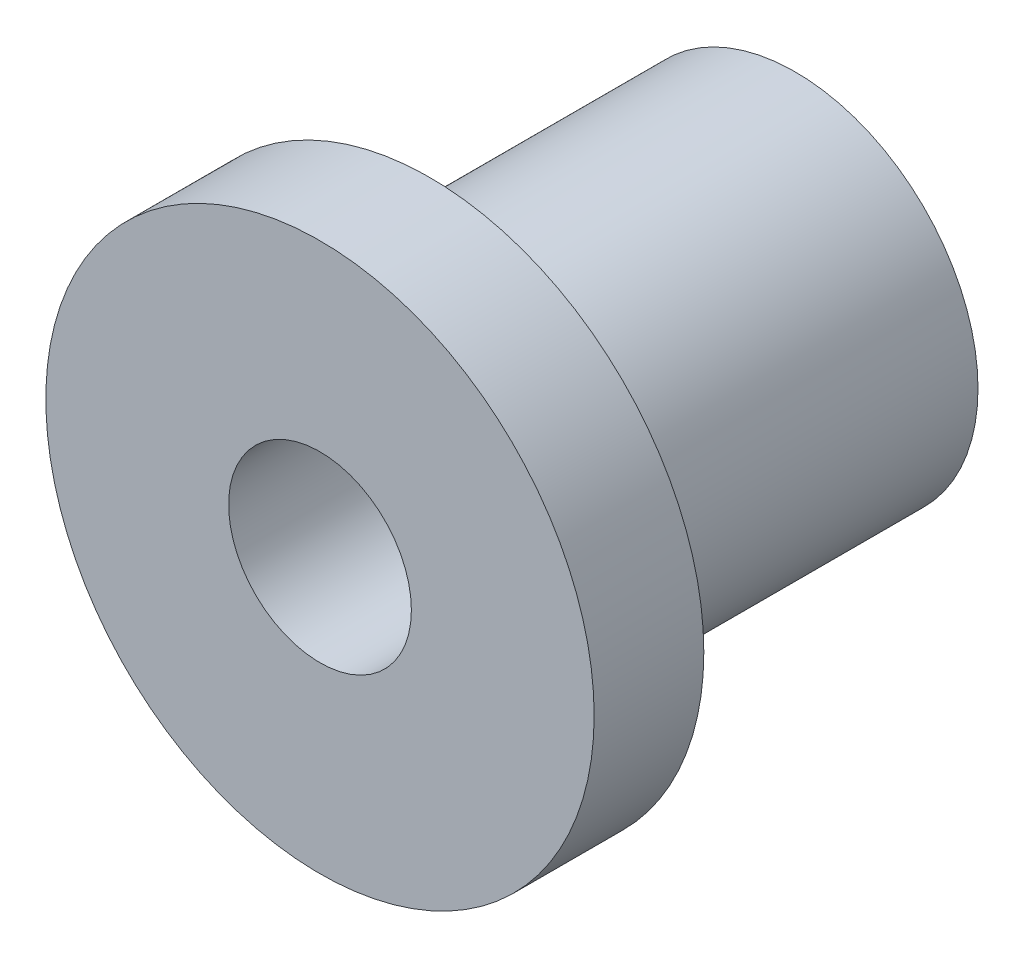
ISO-10303-21;
HEADER;
FILE_DESCRIPTION(('STEP AP214'),'2;1');
FILE_NAME('part.step','',(''),(''),'','','');
FILE_SCHEMA(('AUTOMOTIVE_DESIGN { 1 0 10303 214 1 1 1 1 }'));
ENDSEC;
DATA;
#1=APPLICATION_CONTEXT('core data for automotive mechanical design processes');
#2=APPLICATION_PROTOCOL_DEFINITION('international standard','automotive_design',2000,#1);
#3=PRODUCT_CONTEXT('',#1,'mechanical');
#4=PRODUCT('Part','Part','',(#3));
#5=PRODUCT_RELATED_PRODUCT_CATEGORY('part','',(#4));
#6=PRODUCT_DEFINITION_FORMATION('','',#4);
#7=PRODUCT_DEFINITION_CONTEXT('part definition',#1,'design');
#8=PRODUCT_DEFINITION('design','',#6,#7);
#9=PRODUCT_DEFINITION_SHAPE('','',#8);
#10=(LENGTH_UNIT() NAMED_UNIT(*) SI_UNIT(.MILLI.,.METRE.));
#11=(NAMED_UNIT(*) PLANE_ANGLE_UNIT() SI_UNIT($,.RADIAN.));
#12=(NAMED_UNIT(*) SI_UNIT($,.STERADIAN.) SOLID_ANGLE_UNIT());
#13=UNCERTAINTY_MEASURE_WITH_UNIT(LENGTH_MEASURE(1.E-05),#10,'distance_accuracy_value','');
#14=(GEOMETRIC_REPRESENTATION_CONTEXT(3) GLOBAL_UNCERTAINTY_ASSIGNED_CONTEXT((#13)) GLOBAL_UNIT_ASSIGNED_CONTEXT((#10,
#11,#12)) REPRESENTATION_CONTEXT('',''));
#15=CARTESIAN_POINT('',(0.,0.,0.));
#16=DIRECTION('',(0.,0.,1.));
#17=DIRECTION('',(1.,0.,0.));
#18=AXIS2_PLACEMENT_3D('',#15,#16,#17);
#19=CARTESIAN_POINT('',(0.,0.,0.));
#20=DIRECTION('',(0.,0.,1.));
#21=DIRECTION('',(1.,0.,0.));
#22=AXIS2_PLACEMENT_3D('',#19,#20,#21);
#23=PLANE('',#22);
#24=CARTESIAN_POINT('',(0.,0.,0.));
#25=DIRECTION('',(0.,0.,1.));
#26=DIRECTION('',(1.,0.,0.));
#27=AXIS2_PLACEMENT_3D('',#24,#25,#26);
#28=CIRCLE('',#27,5.);
#29=CARTESIAN_POINT('',(5.,0.,0.));
#30=VERTEX_POINT('',#29);
#31=EDGE_CURVE('E35',#30,#30,#28,.T.);
#32=ORIENTED_EDGE('',*,*,#31,.F.);
#33=EDGE_LOOP('',(#32));
#34=FACE_BOUND('',#33,.T.);
#35=CARTESIAN_POINT('',(0.,0.,0.));
#36=DIRECTION('',(0.,0.,1.));
#37=DIRECTION('',(1.,0.,0.));
#38=AXIS2_PLACEMENT_3D('',#35,#36,#37);
#39=CIRCLE('',#38,2.5);
#40=CARTESIAN_POINT('',(2.5,0.,0.));
#41=VERTEX_POINT('',#40);
#42=EDGE_CURVE('E42',#41,#41,#39,.T.);
#43=ORIENTED_EDGE('',*,*,#42,.T.);
#44=EDGE_LOOP('',(#43));
#45=FACE_BOUND('',#44,.T.);
#46=ADVANCED_FACE('F31',(#34,#45),#23,.F.);
#47=CARTESIAN_POINT('',(0.,0.,10.));
#48=DIRECTION('',(0.,0.,-1.));
#49=DIRECTION('',(-1.,0.,0.));
#50=AXIS2_PLACEMENT_3D('',#47,#48,#49);
#51=CYLINDRICAL_SURFACE('',#50,5.);
#52=CARTESIAN_POINT('',(0.,0.,10.));
#53=DIRECTION('',(0.,0.,1.));
#54=DIRECTION('',(1.,0.,0.));
#55=AXIS2_PLACEMENT_3D('',#52,#53,#54);
#56=CIRCLE('',#55,5.);
#57=CARTESIAN_POINT('',(5.,0.,10.));
#58=VERTEX_POINT('',#57);
#59=EDGE_CURVE('E10',#58,#58,#56,.T.);
#60=ORIENTED_EDGE('',*,*,#59,.F.);
#61=EDGE_LOOP('',(#60));
#62=FACE_BOUND('',#61,.T.);
#63=ORIENTED_EDGE('',*,*,#31,.T.);
#64=EDGE_LOOP('',(#63));
#65=FACE_BOUND('',#64,.T.);
#66=ADVANCED_FACE('F33',(#62,#65),#51,.T.);
#67=CARTESIAN_POINT('',(0.,0.,10.));
#68=DIRECTION('',(0.,0.,-1.));
#69=DIRECTION('',(-1.,0.,0.));
#70=AXIS2_PLACEMENT_3D('',#67,#68,#69);
#71=CYLINDRICAL_SURFACE('',#70,2.5);
#72=ORIENTED_EDGE('',*,*,#42,.F.);
#73=EDGE_LOOP('',(#72));
#74=FACE_BOUND('',#73,.T.);
#75=CARTESIAN_POINT('',(0.,0.,13.));
#76=DIRECTION('',(0.,0.,1.));
#77=DIRECTION('',(1.,0.,0.));
#78=AXIS2_PLACEMENT_3D('',#75,#76,#77);
#79=CIRCLE('',#78,2.5);
#80=CARTESIAN_POINT('',(2.5,0.,13.));
#81=VERTEX_POINT('',#80);
#82=EDGE_CURVE('E50',#81,#81,#79,.T.);
#83=ORIENTED_EDGE('',*,*,#82,.T.);
#84=EDGE_LOOP('',(#83));
#85=FACE_BOUND('',#84,.T.);
#86=ADVANCED_FACE('F56',(#74,#85),#71,.F.);
#87=CARTESIAN_POINT('',(0.,0.,10.));
#88=DIRECTION('',(0.,0.,1.));
#89=DIRECTION('',(1.,0.,0.));
#90=AXIS2_PLACEMENT_3D('',#87,#88,#89);
#91=PLANE('',#90);
#92=CARTESIAN_POINT('',(0.,0.,10.));
#93=DIRECTION('',(0.,0.,1.));
#94=DIRECTION('',(1.,0.,0.));
#95=AXIS2_PLACEMENT_3D('',#92,#93,#94);
#96=CIRCLE('',#95,7.50000000000001);
#97=CARTESIAN_POINT('',(7.50000000000001,0.,10.));
#98=VERTEX_POINT('',#97);
#99=EDGE_CURVE('E47',#98,#98,#96,.T.);
#100=ORIENTED_EDGE('',*,*,#99,.F.);
#101=EDGE_LOOP('',(#100));
#102=FACE_BOUND('',#101,.T.);
#103=ORIENTED_EDGE('',*,*,#59,.T.);
#104=EDGE_LOOP('',(#103));
#105=FACE_BOUND('',#104,.T.);
#106=ADVANCED_FACE('F61',(#102,#105),#91,.F.);
#107=CARTESIAN_POINT('',(0.,0.,13.));
#108=DIRECTION('',(0.,0.,1.));
#109=DIRECTION('',(1.,0.,0.));
#110=AXIS2_PLACEMENT_3D('',#107,#108,#109);
#111=PLANE('',#110);
#112=CARTESIAN_POINT('',(0.,0.,13.));
#113=DIRECTION('',(0.,0.,1.));
#114=DIRECTION('',(1.,0.,0.));
#115=AXIS2_PLACEMENT_3D('',#112,#113,#114);
#116=CIRCLE('',#115,7.50000000000001);
#117=CARTESIAN_POINT('',(7.50000000000001,0.,13.));
#118=VERTEX_POINT('',#117);
#119=EDGE_CURVE('E46',#118,#118,#116,.T.);
#120=ORIENTED_EDGE('',*,*,#119,.T.);
#121=EDGE_LOOP('',(#120));
#122=FACE_BOUND('',#121,.T.);
#123=ORIENTED_EDGE('',*,*,#82,.F.);
#124=EDGE_LOOP('',(#123));
#125=FACE_BOUND('',#124,.T.);
#126=ADVANCED_FACE('F58',(#122,#125),#111,.T.);
#127=CARTESIAN_POINT('',(0.,0.,13.));
#128=DIRECTION('',(0.,0.,-1.));
#129=DIRECTION('',(-1.,0.,0.));
#130=AXIS2_PLACEMENT_3D('',#127,#128,#129);
#131=CYLINDRICAL_SURFACE('',#130,7.50000000000001);
#132=ORIENTED_EDGE('',*,*,#119,.F.);
#133=EDGE_LOOP('',(#132));
#134=FACE_BOUND('',#133,.T.);
#135=ORIENTED_EDGE('',*,*,#99,.T.);
#136=EDGE_LOOP('',(#135));
#137=FACE_BOUND('',#136,.T.);
#138=ADVANCED_FACE('F60',(#134,#137),#131,.T.);
#139=CLOSED_SHELL('',(#46,#66,#86,#106,#126,#138));
#140=MANIFOLD_SOLID_BREP('B2',#139);
#141=ADVANCED_BREP_SHAPE_REPRESENTATION('',(#18,#140),#14);
#142=SHAPE_DEFINITION_REPRESENTATION(#9,#141);
ENDSEC;
END-ISO-10303-21;
